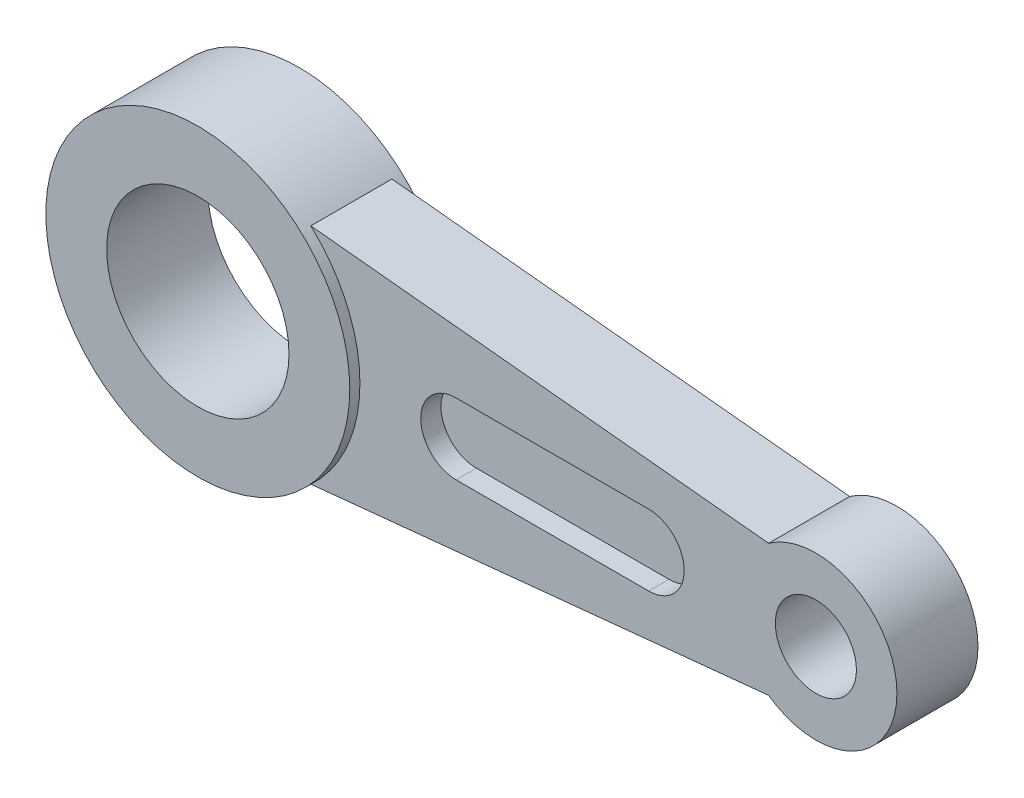
ISO-10303-21;
HEADER;
FILE_DESCRIPTION(('STEP AP214'),'2;1');
FILE_NAME('part.step','',(''),(''),'','','');
FILE_SCHEMA(('AUTOMOTIVE_DESIGN { 1 0 10303 214 1 1 1 1 }'));
ENDSEC;
DATA;
#1=APPLICATION_CONTEXT('core data for automotive mechanical design processes');
#2=APPLICATION_PROTOCOL_DEFINITION('international standard','automotive_design',2000,#1);
#3=PRODUCT_CONTEXT('',#1,'mechanical');
#4=PRODUCT('Part','Part','',(#3));
#5=PRODUCT_RELATED_PRODUCT_CATEGORY('part','',(#4));
#6=PRODUCT_DEFINITION_FORMATION('','',#4);
#7=PRODUCT_DEFINITION_CONTEXT('part definition',#1,'design');
#8=PRODUCT_DEFINITION('design','',#6,#7);
#9=PRODUCT_DEFINITION_SHAPE('','',#8);
#10=(LENGTH_UNIT() NAMED_UNIT(*) SI_UNIT(.MILLI.,.METRE.));
#11=(NAMED_UNIT(*) PLANE_ANGLE_UNIT() SI_UNIT($,.RADIAN.));
#12=(NAMED_UNIT(*) SI_UNIT($,.STERADIAN.) SOLID_ANGLE_UNIT());
#13=UNCERTAINTY_MEASURE_WITH_UNIT(LENGTH_MEASURE(1.E-05),#10,'distance_accuracy_value','');
#14=(GEOMETRIC_REPRESENTATION_CONTEXT(3) GLOBAL_UNCERTAINTY_ASSIGNED_CONTEXT((#13)) GLOBAL_UNIT_ASSIGNED_CONTEXT((#10,
#11,#12)) REPRESENTATION_CONTEXT('',''));
#15=CARTESIAN_POINT('',(0.,0.,0.));
#16=DIRECTION('',(0.,0.,1.));
#17=DIRECTION('',(1.,0.,0.));
#18=AXIS2_PLACEMENT_3D('',#15,#16,#17);
#19=CARTESIAN_POINT('',(0.,0.,-8.));
#20=DIRECTION('',(0.,0.,1.));
#21=DIRECTION('',(1.,0.,0.));
#22=AXIS2_PLACEMENT_3D('',#19,#20,#21);
#23=PLANE('',#22);
#24=DIRECTION('',(-0.99498743710662,0.1,0.));
#25=VECTOR('',#24,1.);
#26=CARTESIAN_POINT('',(121.2,11.9398492452794,-8.));
#27=LINE('',#26,#25);
#28=CARTESIAN_POINT('',(110.670042735129,12.9981497697053,-8.));
#29=VERTEX_POINT('',#28);
#30=CARTESIAN_POINT('',(20.3097738679192,22.0796984905589,-8.));
#31=VERTEX_POINT('',#30);
#32=EDGE_CURVE('E265',#29,#31,#27,.T.);
#33=ORIENTED_EDGE('',*,*,#32,.F.);
#34=CARTESIAN_POINT('',(120.,0.,-8.));
#35=DIRECTION('',(0.,0.,1.));
#36=DIRECTION('',(1.,0.,0.));
#37=AXIS2_PLACEMENT_3D('',#34,#35,#36);
#38=CIRCLE('',#37,16.);
#39=CARTESIAN_POINT('',(110.670042735129,-12.9981497697053,-8.));
#40=VERTEX_POINT('',#39);
#41=EDGE_CURVE('E226',#40,#29,#38,.T.);
#42=ORIENTED_EDGE('',*,*,#41,.F.);
#43=DIRECTION('',(0.99498743710662,0.1,0.));
#44=VECTOR('',#43,1.);
#45=CARTESIAN_POINT('',(2.4,-23.8796984905589,-8.));
#46=LINE('',#45,#44);
#47=CARTESIAN_POINT('',(20.3097738679192,-22.0796984905589,-8.));
#48=VERTEX_POINT('',#47);
#49=EDGE_CURVE('E260',#48,#40,#46,.T.);
#50=ORIENTED_EDGE('',*,*,#49,.F.);
#51=CARTESIAN_POINT('',(0.,0.,-8.));
#52=DIRECTION('',(0.,0.,1.));
#53=DIRECTION('',(1.,0.,0.));
#54=AXIS2_PLACEMENT_3D('',#51,#52,#53);
#55=CIRCLE('',#54,30.);
#56=EDGE_CURVE('E11',#31,#48,#55,.F.);
#57=ORIENTED_EDGE('',*,*,#56,.F.);
#58=EDGE_LOOP('',(#33,#42,#50,#57));
#59=FACE_BOUND('',#58,.T.);
#60=CARTESIAN_POINT('',(120.,0.,-8.00000000000001));
#61=DIRECTION('',(0.,0.,1.));
#62=DIRECTION('',(1.,0.,0.));
#63=AXIS2_PLACEMENT_3D('',#60,#61,#62);
#64=CIRCLE('',#63,8.00000000000001);
#65=CARTESIAN_POINT('',(128.,0.,-8.00000000000001));
#66=VERTEX_POINT('',#65);
#67=EDGE_CURVE('E56',#66,#66,#64,.T.);
#68=ORIENTED_EDGE('',*,*,#67,.T.);
#69=EDGE_LOOP('',(#68));
#70=FACE_BOUND('',#69,.T.);
#71=CARTESIAN_POINT('',(49.,0.,-8.));
#72=DIRECTION('',(0.,0.,1.));
#73=DIRECTION('',(1.,0.,0.));
#74=AXIS2_PLACEMENT_3D('',#71,#72,#73);
#75=CIRCLE('',#74,7.);
#76=CARTESIAN_POINT('',(49.,7.,-8.));
#77=VERTEX_POINT('',#76);
#78=CARTESIAN_POINT('',(49.,-7.,-8.));
#79=VERTEX_POINT('',#78);
#80=EDGE_CURVE('E70',#77,#79,#75,.T.);
#81=ORIENTED_EDGE('',*,*,#80,.T.);
#82=DIRECTION('',(1.,0.,0.));
#83=VECTOR('',#82,1.);
#84=CARTESIAN_POINT('',(49.,-7.,-8.));
#85=LINE('',#84,#83);
#86=CARTESIAN_POINT('',(87.,-7.,-8.));
#87=VERTEX_POINT('',#86);
#88=EDGE_CURVE('E165',#79,#87,#85,.T.);
#89=ORIENTED_EDGE('',*,*,#88,.T.);
#90=CARTESIAN_POINT('',(87.,0.,-8.));
#91=DIRECTION('',(0.,0.,1.));
#92=DIRECTION('',(1.,0.,0.));
#93=AXIS2_PLACEMENT_3D('',#90,#91,#92);
#94=CIRCLE('',#93,7.);
#95=CARTESIAN_POINT('',(87.,7.,-8.));
#96=VERTEX_POINT('',#95);
#97=EDGE_CURVE('E380',#87,#96,#94,.T.);
#98=ORIENTED_EDGE('',*,*,#97,.T.);
#99=DIRECTION('',(-1.,0.,0.));
#100=VECTOR('',#99,1.);
#101=CARTESIAN_POINT('',(87.,7.,-8.));
#102=LINE('',#101,#100);
#103=EDGE_CURVE('E161',#96,#77,#102,.T.);
#104=ORIENTED_EDGE('',*,*,#103,.T.);
#105=EDGE_LOOP('',(#81,#89,#98,#104));
#106=FACE_BOUND('',#105,.T.);
#107=ADVANCED_FACE('F51',(#59,#70,#106),#23,.F.);
#108=CARTESIAN_POINT('',(2.4,-23.8796984905589,8.));
#109=DIRECTION('',(-0.1,0.99498743710662,0.));
#110=DIRECTION('',(-0.99498743710662,-0.1,0.));
#111=AXIS2_PLACEMENT_3D('',#108,#109,#110);
#112=PLANE('',#111);
#113=DIRECTION('',(0.,0.,-1.));
#114=VECTOR('',#113,1.);
#115=CARTESIAN_POINT('',(110.670042735129,-12.9981497697053,8.));
#116=LINE('',#115,#114);
#117=CARTESIAN_POINT('',(110.670042735129,-12.9981497697053,8.));
#118=VERTEX_POINT('',#117);
#119=EDGE_CURVE('E238',#118,#40,#116,.T.);
#120=ORIENTED_EDGE('',*,*,#119,.F.);
#121=DIRECTION('',(0.99498743710662,0.1,0.));
#122=VECTOR('',#121,1.);
#123=CARTESIAN_POINT('',(2.4,-23.8796984905589,8.));
#124=LINE('',#123,#122);
#125=CARTESIAN_POINT('',(20.3097738679192,-22.0796984905589,8.));
#126=VERTEX_POINT('',#125);
#127=EDGE_CURVE('E261',#126,#118,#124,.T.);
#128=ORIENTED_EDGE('',*,*,#127,.F.);
#129=DIRECTION('',(0.,0.,-1.));
#130=VECTOR('',#129,1.);
#131=CARTESIAN_POINT('',(20.3097738679191,-22.0796984905589,10.));
#132=LINE('',#131,#130);
#133=EDGE_CURVE('E253',#48,#126,#132,.F.);
#134=ORIENTED_EDGE('',*,*,#133,.F.);
#135=ORIENTED_EDGE('',*,*,#49,.T.);
#136=EDGE_LOOP('',(#120,#128,#134,#135));
#137=FACE_BOUND('',#136,.T.);
#138=ADVANCED_FACE('F54',(#137),#112,.F.);
#139=CARTESIAN_POINT('',(121.2,11.9398492452794,8.));
#140=DIRECTION('',(-0.1,-0.99498743710662,0.));
#141=DIRECTION('',(0.99498743710662,-0.1,0.));
#142=AXIS2_PLACEMENT_3D('',#139,#140,#141);
#143=PLANE('',#142);
#144=DIRECTION('',(0.,0.,-1.));
#145=VECTOR('',#144,1.);
#146=CARTESIAN_POINT('',(110.670042735129,12.9981497697053,8.));
#147=LINE('',#146,#145);
#148=CARTESIAN_POINT('',(110.670042735129,12.9981497697053,8.));
#149=VERTEX_POINT('',#148);
#150=EDGE_CURVE('E231',#29,#149,#147,.F.);
#151=ORIENTED_EDGE('',*,*,#150,.F.);
#152=ORIENTED_EDGE('',*,*,#32,.T.);
#153=DIRECTION('',(0.,0.,-1.));
#154=VECTOR('',#153,1.);
#155=CARTESIAN_POINT('',(20.3097738679191,22.0796984905589,10.));
#156=LINE('',#155,#154);
#157=CARTESIAN_POINT('',(20.3097738679192,22.0796984905589,8.));
#158=VERTEX_POINT('',#157);
#159=EDGE_CURVE('E246',#158,#31,#156,.T.);
#160=ORIENTED_EDGE('',*,*,#159,.F.);
#161=DIRECTION('',(-0.99498743710662,0.1,0.));
#162=VECTOR('',#161,1.);
#163=CARTESIAN_POINT('',(121.2,11.9398492452794,8.));
#164=LINE('',#163,#162);
#165=EDGE_CURVE('E62',#149,#158,#164,.T.);
#166=ORIENTED_EDGE('',*,*,#165,.F.);
#167=EDGE_LOOP('',(#151,#152,#160,#166));
#168=FACE_BOUND('',#167,.T.);
#169=ADVANCED_FACE('F299',(#168),#143,.F.);
#170=CARTESIAN_POINT('',(0.,0.,8.));
#171=DIRECTION('',(0.,0.,1.));
#172=DIRECTION('',(1.,0.,0.));
#173=AXIS2_PLACEMENT_3D('',#170,#171,#172);
#174=PLANE('',#173);
#175=CARTESIAN_POINT('',(49.,0.,8.));
#176=DIRECTION('',(0.,0.,1.));
#177=DIRECTION('',(1.,0.,0.));
#178=AXIS2_PLACEMENT_3D('',#175,#176,#177);
#179=CIRCLE('',#178,7.);
#180=CARTESIAN_POINT('',(49.,7.,8.));
#181=VERTEX_POINT('',#180);
#182=CARTESIAN_POINT('',(49.,-7.,8.));
#183=VERTEX_POINT('',#182);
#184=EDGE_CURVE('E78',#181,#183,#179,.T.);
#185=ORIENTED_EDGE('',*,*,#184,.F.);
#186=DIRECTION('',(-1.,0.,0.));
#187=VECTOR('',#186,1.);
#188=CARTESIAN_POINT('',(87.,7.,8.));
#189=LINE('',#188,#187);
#190=CARTESIAN_POINT('',(87.,7.,8.));
#191=VERTEX_POINT('',#190);
#192=EDGE_CURVE('E184',#191,#181,#189,.T.);
#193=ORIENTED_EDGE('',*,*,#192,.F.);
#194=CARTESIAN_POINT('',(87.,0.,8.));
#195=DIRECTION('',(0.,0.,1.));
#196=DIRECTION('',(1.,0.,0.));
#197=AXIS2_PLACEMENT_3D('',#194,#195,#196);
#198=CIRCLE('',#197,7.);
#199=CARTESIAN_POINT('',(87.,-7.,8.));
#200=VERTEX_POINT('',#199);
#201=EDGE_CURVE('E200',#200,#191,#198,.T.);
#202=ORIENTED_EDGE('',*,*,#201,.F.);
#203=DIRECTION('',(1.,0.,0.));
#204=VECTOR('',#203,1.);
#205=CARTESIAN_POINT('',(49.,-7.,8.));
#206=LINE('',#205,#204);
#207=EDGE_CURVE('E172',#183,#200,#206,.T.);
#208=ORIENTED_EDGE('',*,*,#207,.F.);
#209=EDGE_LOOP('',(#185,#193,#202,#208));
#210=FACE_BOUND('',#209,.T.);
#211=CARTESIAN_POINT('',(120.,0.,8.00000000000001));
#212=DIRECTION('',(0.,0.,1.));
#213=DIRECTION('',(1.,0.,0.));
#214=AXIS2_PLACEMENT_3D('',#211,#212,#213);
#215=CIRCLE('',#214,8.00000000000001);
#216=CARTESIAN_POINT('',(128.,0.,8.00000000000001));
#217=VERTEX_POINT('',#216);
#218=EDGE_CURVE('E217',#217,#217,#215,.T.);
#219=ORIENTED_EDGE('',*,*,#218,.F.);
#220=EDGE_LOOP('',(#219));
#221=FACE_BOUND('',#220,.T.);
#222=CARTESIAN_POINT('',(120.,0.,8.));
#223=DIRECTION('',(0.,0.,1.));
#224=DIRECTION('',(1.,0.,0.));
#225=AXIS2_PLACEMENT_3D('',#222,#223,#224);
#226=CIRCLE('',#225,16.);
#227=EDGE_CURVE('E227',#118,#149,#226,.T.);
#228=ORIENTED_EDGE('',*,*,#227,.T.);
#229=ORIENTED_EDGE('',*,*,#165,.T.);
#230=CARTESIAN_POINT('',(0.,0.,8.));
#231=DIRECTION('',(0.,0.,1.));
#232=DIRECTION('',(1.,0.,0.));
#233=AXIS2_PLACEMENT_3D('',#230,#231,#232);
#234=CIRCLE('',#233,30.);
#235=EDGE_CURVE('E257',#158,#126,#234,.F.);
#236=ORIENTED_EDGE('',*,*,#235,.T.);
#237=ORIENTED_EDGE('',*,*,#127,.T.);
#238=EDGE_LOOP('',(#228,#229,#236,#237));
#239=FACE_BOUND('',#238,.T.);
#240=ADVANCED_FACE('F306',(#210,#221,#239),#174,.T.);
#241=CARTESIAN_POINT('',(0.,0.,10.));
#242=DIRECTION('',(0.,0.,-1.));
#243=DIRECTION('',(-1.,0.,0.));
#244=AXIS2_PLACEMENT_3D('',#241,#242,#243);
#245=CYLINDRICAL_SURFACE('',#244,30.);
#246=ORIENTED_EDGE('',*,*,#235,.F.);
#247=ORIENTED_EDGE('',*,*,#159,.T.);
#248=ORIENTED_EDGE('',*,*,#56,.T.);
#249=ORIENTED_EDGE('',*,*,#133,.T.);
#250=EDGE_LOOP('',(#246,#247,#248,#249));
#251=FACE_BOUND('',#250,.T.);
#252=CARTESIAN_POINT('',(0.,0.,10.));
#253=DIRECTION('',(0.,0.,1.));
#254=DIRECTION('',(1.,0.,0.));
#255=AXIS2_PLACEMENT_3D('',#252,#253,#254);
#256=CIRCLE('',#255,30.);
#257=CARTESIAN_POINT('',(30.,0.,10.));
#258=VERTEX_POINT('',#257);
#259=EDGE_CURVE('E243',#258,#258,#256,.T.);
#260=ORIENTED_EDGE('',*,*,#259,.F.);
#261=EDGE_LOOP('',(#260));
#262=FACE_BOUND('',#261,.T.);
#263=CARTESIAN_POINT('',(0.,0.,-10.));
#264=DIRECTION('',(0.,0.,1.));
#265=DIRECTION('',(1.,0.,0.));
#266=AXIS2_PLACEMENT_3D('',#263,#264,#265);
#267=CIRCLE('',#266,30.);
#268=CARTESIAN_POINT('',(30.,0.,-10.));
#269=VERTEX_POINT('',#268);
#270=EDGE_CURVE('E242',#269,#269,#267,.T.);
#271=ORIENTED_EDGE('',*,*,#270,.T.);
#272=EDGE_LOOP('',(#271));
#273=FACE_BOUND('',#272,.T.);
#274=ADVANCED_FACE('F313',(#251,#262,#273),#245,.T.);
#275=CARTESIAN_POINT('',(0.,0.,10.));
#276=DIRECTION('',(0.,0.,1.));
#277=DIRECTION('',(1.,0.,0.));
#278=AXIS2_PLACEMENT_3D('',#275,#276,#277);
#279=PLANE('',#278);
#280=CARTESIAN_POINT('',(0.,0.,10.));
#281=DIRECTION('',(0.,0.,1.));
#282=DIRECTION('',(1.,0.,0.));
#283=AXIS2_PLACEMENT_3D('',#280,#281,#282);
#284=CIRCLE('',#283,18.);
#285=CARTESIAN_POINT('',(18.,0.,10.));
#286=VERTEX_POINT('',#285);
#287=EDGE_CURVE('E222',#286,#286,#284,.T.);
#288=ORIENTED_EDGE('',*,*,#287,.F.);
#289=EDGE_LOOP('',(#288));
#290=FACE_BOUND('',#289,.T.);
#291=ORIENTED_EDGE('',*,*,#259,.T.);
#292=EDGE_LOOP('',(#291));
#293=FACE_BOUND('',#292,.T.);
#294=ADVANCED_FACE('F326',(#290,#293),#279,.T.);
#295=CARTESIAN_POINT('',(0.,0.,-10.));
#296=DIRECTION('',(0.,0.,1.));
#297=DIRECTION('',(1.,0.,0.));
#298=AXIS2_PLACEMENT_3D('',#295,#296,#297);
#299=PLANE('',#298);
#300=CARTESIAN_POINT('',(0.,0.,-10.));
#301=DIRECTION('',(0.,0.,1.));
#302=DIRECTION('',(1.,0.,0.));
#303=AXIS2_PLACEMENT_3D('',#300,#301,#302);
#304=CIRCLE('',#303,18.);
#305=CARTESIAN_POINT('',(18.,0.,-10.));
#306=VERTEX_POINT('',#305);
#307=EDGE_CURVE('E221',#306,#306,#304,.T.);
#308=ORIENTED_EDGE('',*,*,#307,.T.);
#309=EDGE_LOOP('',(#308));
#310=FACE_BOUND('',#309,.T.);
#311=ORIENTED_EDGE('',*,*,#270,.F.);
#312=EDGE_LOOP('',(#311));
#313=FACE_BOUND('',#312,.T.);
#314=ADVANCED_FACE('F276',(#310,#313),#299,.F.);
#315=CARTESIAN_POINT('',(120.,0.,8.));
#316=DIRECTION('',(0.,0.,-1.));
#317=DIRECTION('',(-1.,0.,0.));
#318=AXIS2_PLACEMENT_3D('',#315,#316,#317);
#319=CYLINDRICAL_SURFACE('',#318,16.);
#320=ORIENTED_EDGE('',*,*,#227,.F.);
#321=ORIENTED_EDGE('',*,*,#119,.T.);
#322=ORIENTED_EDGE('',*,*,#41,.T.);
#323=ORIENTED_EDGE('',*,*,#150,.T.);
#324=EDGE_LOOP('',(#320,#321,#322,#323));
#325=FACE_BOUND('',#324,.T.);
#326=ADVANCED_FACE('F282',(#325),#319,.T.);
#327=CARTESIAN_POINT('',(0.,0.,-167.));
#328=DIRECTION('',(0.,0.,1.));
#329=DIRECTION('',(1.,0.,0.));
#330=AXIS2_PLACEMENT_3D('',#327,#328,#329);
#331=CYLINDRICAL_SURFACE('',#330,18.);
#332=CARTESIAN_POINT('',(18.,0.,10.));
#333=CARTESIAN_POINT('',(18.,0.,9.79166666666668));
#334=CARTESIAN_POINT('',(18.,0.,9.58333333333335));
#335=CARTESIAN_POINT('',(18.,0.,9.16666666666668));
#336=CARTESIAN_POINT('',(18.,0.,8.95833333333335));
#337=CARTESIAN_POINT('',(18.,0.,8.54166666666667));
#338=CARTESIAN_POINT('',(18.,0.,8.33333333333333));
#339=CARTESIAN_POINT('',(18.,0.,7.91666666666666));
#340=CARTESIAN_POINT('',(18.,0.,7.70833333333334));
#341=CARTESIAN_POINT('',(18.,0.,7.29166666666668));
#342=CARTESIAN_POINT('',(18.,0.,7.08333333333335));
#343=CARTESIAN_POINT('',(18.,0.,6.66666666666668));
#344=CARTESIAN_POINT('',(18.,0.,6.45833333333334));
#345=CARTESIAN_POINT('',(18.,0.,6.04166666666667));
#346=CARTESIAN_POINT('',(18.,0.,5.83333333333333));
#347=CARTESIAN_POINT('',(18.,0.,5.41666666666666));
#348=CARTESIAN_POINT('',(18.,0.,5.20833333333333));
#349=CARTESIAN_POINT('',(18.,0.,4.79166666666668));
#350=CARTESIAN_POINT('',(18.,0.,4.58333333333335));
#351=CARTESIAN_POINT('',(18.,0.,4.16666666666668));
#352=CARTESIAN_POINT('',(18.,0.,3.95833333333334));
#353=CARTESIAN_POINT('',(18.,0.,3.54166666666667));
#354=CARTESIAN_POINT('',(18.,0.,3.33333333333333));
#355=CARTESIAN_POINT('',(18.,0.,2.91666666666666));
#356=CARTESIAN_POINT('',(18.,0.,2.70833333333333));
#357=CARTESIAN_POINT('',(18.,0.,2.29166666666667));
#358=CARTESIAN_POINT('',(18.,0.,2.08333333333334));
#359=CARTESIAN_POINT('',(18.,0.,1.66666666666668));
#360=CARTESIAN_POINT('',(18.,0.,1.45833333333334));
#361=CARTESIAN_POINT('',(18.,0.,1.04166666666666));
#362=CARTESIAN_POINT('',(18.,0.,0.833333333333325));
#363=CARTESIAN_POINT('',(18.,0.,0.416666666666658));
#364=CARTESIAN_POINT('',(18.,0.,0.208333333333329));
#365=CARTESIAN_POINT('',(18.,0.,-0.208333333333329));
#366=CARTESIAN_POINT('',(18.,0.,-0.416666666666658));
#367=CARTESIAN_POINT('',(18.,0.,-0.833333333333325));
#368=CARTESIAN_POINT('',(18.,0.,-1.04166666666666));
#369=CARTESIAN_POINT('',(18.,0.,-1.45833333333334));
#370=CARTESIAN_POINT('',(18.,0.,-1.66666666666668));
#371=CARTESIAN_POINT('',(18.,0.,-2.08333333333334));
#372=CARTESIAN_POINT('',(18.,0.,-2.29166666666667));
#373=CARTESIAN_POINT('',(18.,0.,-2.70833333333333));
#374=CARTESIAN_POINT('',(18.,0.,-2.91666666666666));
#375=CARTESIAN_POINT('',(18.,0.,-3.33333333333333));
#376=CARTESIAN_POINT('',(18.,0.,-3.54166666666667));
#377=CARTESIAN_POINT('',(18.,0.,-3.95833333333334));
#378=CARTESIAN_POINT('',(18.,0.,-4.16666666666668));
#379=CARTESIAN_POINT('',(18.,0.,-4.58333333333335));
#380=CARTESIAN_POINT('',(18.,0.,-4.79166666666668));
#381=CARTESIAN_POINT('',(18.,0.,-5.20833333333333));
#382=CARTESIAN_POINT('',(18.,0.,-5.41666666666666));
#383=CARTESIAN_POINT('',(18.,0.,-5.83333333333333));
#384=CARTESIAN_POINT('',(18.,0.,-6.04166666666667));
#385=CARTESIAN_POINT('',(18.,0.,-6.45833333333334));
#386=CARTESIAN_POINT('',(18.,0.,-6.66666666666668));
#387=CARTESIAN_POINT('',(18.,0.,-7.08333333333335));
#388=CARTESIAN_POINT('',(18.,0.,-7.29166666666668));
#389=CARTESIAN_POINT('',(18.,0.,-7.70833333333334));
#390=CARTESIAN_POINT('',(18.,0.,-7.91666666666666));
#391=CARTESIAN_POINT('',(18.,0.,-8.33333333333333));
#392=CARTESIAN_POINT('',(18.,0.,-8.54166666666667));
#393=CARTESIAN_POINT('',(18.,0.,-8.95833333333335));
#394=CARTESIAN_POINT('',(18.,0.,-9.16666666666668));
#395=CARTESIAN_POINT('',(18.,0.,-9.58333333333335));
#396=CARTESIAN_POINT('',(18.,0.,-9.79166666666668));
#397=CARTESIAN_POINT('',(18.,0.,-10.));
#398=B_SPLINE_CURVE_WITH_KNOTS('',3,(#332,#333,#334,#335,#336,#337,#338,#339,#340,#341,#342,
#343,#344,#345,#346,#347,#348,#349,#350,#351,#352,#353,#354,#355,#356,#357,#358,#359,#360,#361,
#362,#363,#364,#365,#366,#367,#368,#369,#370,#371,#372,#373,#374,#375,#376,#377,#378,#379,#380,
#381,#382,#383,#384,#385,#386,#387,#388,#389,#390,#391,#392,#393,#394,#395,#396,#397),
.UNSPECIFIED.,.F.,.F.,(4,2,2,2,2,2,2,2,2,2,2,2,2,2,2,2,2,2,2,2,2,2,2,2,2,2,2,2,2,2,2,2,4),(0.,
0.624999999999987,1.25,1.87500000000002,2.5,3.12499999999999,3.75,4.37500000000002,5.,
5.62499999999999,6.25000000000001,6.87500000000002,7.50000000000001,8.12499999999999,
8.75000000000001,9.37500000000002,10.,10.625,11.25,11.875,12.5,13.125,13.75,14.375,15.,15.625,
16.25,16.875,17.5,18.125,18.75,19.375,20.),.UNSPECIFIED.);
#399=EDGE_CURVE('BSEAM279',#286,#306,#398,.T.);
#400=ORIENTED_EDGE('',*,*,#287,.T.);
#401=ORIENTED_EDGE('',*,*,#307,.F.);
#402=ORIENTED_EDGE('',*,*,#399,.T.);
#403=ORIENTED_EDGE('',*,*,#399,.F.);
#404=EDGE_LOOP('',(#400,#402,#401,#403));
#405=FACE_BOUND('',#404,.T.);
#406=ADVANCED_FACE('F279',(#405),#331,.F.);
#407=CARTESIAN_POINT('',(120.,0.,-167.));
#408=DIRECTION('',(0.,0.,1.));
#409=DIRECTION('',(1.,0.,0.));
#410=AXIS2_PLACEMENT_3D('',#407,#408,#409);
#411=CYLINDRICAL_SURFACE('',#410,8.00000000000001);
#412=CARTESIAN_POINT('',(128.,0.,8.00000000000001));
#413=CARTESIAN_POINT('',(128.,0.,7.83333333333334));
#414=CARTESIAN_POINT('',(128.,0.,7.66666666666667));
#415=CARTESIAN_POINT('',(128.,0.,7.33333333333334));
#416=CARTESIAN_POINT('',(128.,0.,7.16666666666667));
#417=CARTESIAN_POINT('',(128.,0.,6.83333333333334));
#418=CARTESIAN_POINT('',(128.,0.,6.66666666666667));
#419=CARTESIAN_POINT('',(128.,0.,6.33333333333334));
#420=CARTESIAN_POINT('',(128.,0.,6.16666666666667));
#421=CARTESIAN_POINT('',(128.,0.,5.83333333333334));
#422=CARTESIAN_POINT('',(128.,0.,5.66666666666667));
#423=CARTESIAN_POINT('',(128.,0.,5.33333333333334));
#424=CARTESIAN_POINT('',(128.,0.,5.16666666666667));
#425=CARTESIAN_POINT('',(128.,0.,4.83333333333334));
#426=CARTESIAN_POINT('',(128.,0.,4.66666666666667));
#427=CARTESIAN_POINT('',(128.,0.,4.33333333333334));
#428=CARTESIAN_POINT('',(128.,0.,4.16666666666667));
#429=CARTESIAN_POINT('',(128.,0.,3.83333333333334));
#430=CARTESIAN_POINT('',(128.,0.,3.66666666666667));
#431=CARTESIAN_POINT('',(128.,0.,3.33333333333334));
#432=CARTESIAN_POINT('',(128.,0.,3.16666666666667));
#433=CARTESIAN_POINT('',(128.,0.,2.83333333333334));
#434=CARTESIAN_POINT('',(128.,0.,2.66666666666667));
#435=CARTESIAN_POINT('',(128.,0.,2.33333333333334));
#436=CARTESIAN_POINT('',(128.,0.,2.16666666666667));
#437=CARTESIAN_POINT('',(128.,0.,1.83333333333334));
#438=CARTESIAN_POINT('',(128.,0.,1.66666666666667));
#439=CARTESIAN_POINT('',(128.,0.,1.33333333333333));
#440=CARTESIAN_POINT('',(128.,0.,1.16666666666667));
#441=CARTESIAN_POINT('',(128.,0.,0.833333333333334));
#442=CARTESIAN_POINT('',(128.,0.,0.666666666666667));
#443=CARTESIAN_POINT('',(128.,0.,0.333333333333334));
#444=CARTESIAN_POINT('',(128.,0.,0.166666666666667));
#445=CARTESIAN_POINT('',(128.,0.,-0.166666666666667));
#446=CARTESIAN_POINT('',(128.,0.,-0.333333333333334));
#447=CARTESIAN_POINT('',(128.,0.,-0.666666666666667));
#448=CARTESIAN_POINT('',(128.,0.,-0.833333333333334));
#449=CARTESIAN_POINT('',(128.,0.,-1.16666666666667));
#450=CARTESIAN_POINT('',(128.,0.,-1.33333333333333));
#451=CARTESIAN_POINT('',(128.,0.,-1.66666666666667));
#452=CARTESIAN_POINT('',(128.,0.,-1.83333333333334));
#453=CARTESIAN_POINT('',(128.,0.,-2.16666666666667));
#454=CARTESIAN_POINT('',(128.,0.,-2.33333333333334));
#455=CARTESIAN_POINT('',(128.,0.,-2.66666666666667));
#456=CARTESIAN_POINT('',(128.,0.,-2.83333333333334));
#457=CARTESIAN_POINT('',(128.,0.,-3.16666666666667));
#458=CARTESIAN_POINT('',(128.,0.,-3.33333333333334));
#459=CARTESIAN_POINT('',(128.,0.,-3.66666666666667));
#460=CARTESIAN_POINT('',(128.,0.,-3.83333333333334));
#461=CARTESIAN_POINT('',(128.,0.,-4.16666666666667));
#462=CARTESIAN_POINT('',(128.,0.,-4.33333333333334));
#463=CARTESIAN_POINT('',(128.,0.,-4.66666666666667));
#464=CARTESIAN_POINT('',(128.,0.,-4.83333333333334));
#465=CARTESIAN_POINT('',(128.,0.,-5.16666666666667));
#466=CARTESIAN_POINT('',(128.,0.,-5.33333333333334));
#467=CARTESIAN_POINT('',(128.,0.,-5.66666666666667));
#468=CARTESIAN_POINT('',(128.,0.,-5.83333333333334));
#469=CARTESIAN_POINT('',(128.,0.,-6.16666666666667));
#470=CARTESIAN_POINT('',(128.,0.,-6.33333333333334));
#471=CARTESIAN_POINT('',(128.,0.,-6.66666666666667));
#472=CARTESIAN_POINT('',(128.,0.,-6.83333333333334));
#473=CARTESIAN_POINT('',(128.,0.,-7.16666666666667));
#474=CARTESIAN_POINT('',(128.,0.,-7.33333333333334));
#475=CARTESIAN_POINT('',(128.,0.,-7.66666666666667));
#476=CARTESIAN_POINT('',(128.,0.,-7.83333333333334));
#477=CARTESIAN_POINT('',(128.,0.,-8.00000000000001));
#478=B_SPLINE_CURVE_WITH_KNOTS('',3,(#412,#413,#414,#415,#416,#417,#418,#419,#420,#421,#422,
#423,#424,#425,#426,#427,#428,#429,#430,#431,#432,#433,#434,#435,#436,#437,#438,#439,#440,#441,
#442,#443,#444,#445,#446,#447,#448,#449,#450,#451,#452,#453,#454,#455,#456,#457,#458,#459,#460,
#461,#462,#463,#464,#465,#466,#467,#468,#469,#470,#471,#472,#473,#474,#475,#476,#477),
.UNSPECIFIED.,.F.,.F.,(4,2,2,2,2,2,2,2,2,2,2,2,2,2,2,2,2,2,2,2,2,2,2,2,2,2,2,2,2,2,2,2,4),(0.,
0.5,1.,1.5,2.,2.5,3.,3.5,4.,4.5,5.,5.50000000000001,6.00000000000001,6.50000000000001,
7.00000000000001,7.50000000000001,8.00000000000001,8.50000000000001,9.00000000000001,
9.50000000000001,10.,10.5,11.,11.5,12.,12.5,13.,13.5,14.,14.5,15.,15.5,16.),.UNSPECIFIED.);
#479=EDGE_CURVE('BSEAM281',#217,#66,#478,.T.);
#480=ORIENTED_EDGE('',*,*,#218,.T.);
#481=ORIENTED_EDGE('',*,*,#67,.F.);
#482=ORIENTED_EDGE('',*,*,#479,.T.);
#483=ORIENTED_EDGE('',*,*,#479,.F.);
#484=EDGE_LOOP('',(#480,#482,#481,#483));
#485=FACE_BOUND('',#484,.T.);
#486=ADVANCED_FACE('F281',(#485),#411,.F.);
#487=CARTESIAN_POINT('',(49.,0.,4.));
#488=DIRECTION('',(0.,0.,1.));
#489=DIRECTION('',(1.,0.,0.));
#490=AXIS2_PLACEMENT_3D('',#487,#488,#489);
#491=CYLINDRICAL_SURFACE('',#490,7.);
#492=ORIENTED_EDGE('',*,*,#184,.T.);
#493=DIRECTION('',(0.,0.,1.));
#494=VECTOR('',#493,1.);
#495=CARTESIAN_POINT('',(49.,-7.,4.));
#496=LINE('',#495,#494);
#497=CARTESIAN_POINT('',(49.,-7.,4.));
#498=VERTEX_POINT('',#497);
#499=EDGE_CURVE('E195',#498,#183,#496,.T.);
#500=ORIENTED_EDGE('',*,*,#499,.F.);
#501=CARTESIAN_POINT('',(49.,0.,4.));
#502=DIRECTION('',(0.,0.,1.));
#503=DIRECTION('',(1.,0.,0.));
#504=AXIS2_PLACEMENT_3D('',#501,#502,#503);
#505=CIRCLE('',#504,7.);
#506=CARTESIAN_POINT('',(49.,7.,4.));
#507=VERTEX_POINT('',#506);
#508=EDGE_CURVE('E179',#507,#498,#505,.T.);
#509=ORIENTED_EDGE('',*,*,#508,.F.);
#510=DIRECTION('',(0.,0.,1.));
#511=VECTOR('',#510,1.);
#512=CARTESIAN_POINT('',(49.,7.,4.));
#513=LINE('',#512,#511);
#514=EDGE_CURVE('E207',#507,#181,#513,.T.);
#515=ORIENTED_EDGE('',*,*,#514,.T.);
#516=EDGE_LOOP('',(#492,#500,#509,#515));
#517=FACE_BOUND('',#516,.T.);
#518=ADVANCED_FACE('F288',(#517),#491,.F.);
#519=CARTESIAN_POINT('',(87.,7.,4.));
#520=DIRECTION('',(0.,1.,0.));
#521=DIRECTION('',(0.,0.,1.));
#522=AXIS2_PLACEMENT_3D('',#519,#520,#521);
#523=PLANE('',#522);
#524=ORIENTED_EDGE('',*,*,#192,.T.);
#525=ORIENTED_EDGE('',*,*,#514,.F.);
#526=DIRECTION('',(-1.,0.,0.));
#527=VECTOR('',#526,1.);
#528=CARTESIAN_POINT('',(87.,7.,4.));
#529=LINE('',#528,#527);
#530=CARTESIAN_POINT('',(87.,7.,4.));
#531=VERTEX_POINT('',#530);
#532=EDGE_CURVE('E192',#531,#507,#529,.T.);
#533=ORIENTED_EDGE('',*,*,#532,.F.);
#534=DIRECTION('',(0.,0.,1.));
#535=VECTOR('',#534,1.);
#536=CARTESIAN_POINT('',(87.,7.,4.));
#537=LINE('',#536,#535);
#538=EDGE_CURVE('E210',#531,#191,#537,.T.);
#539=ORIENTED_EDGE('',*,*,#538,.T.);
#540=EDGE_LOOP('',(#524,#525,#533,#539));
#541=FACE_BOUND('',#540,.T.);
#542=ADVANCED_FACE('F347',(#541),#523,.F.);
#543=CARTESIAN_POINT('',(87.,0.,4.));
#544=DIRECTION('',(0.,0.,1.));
#545=DIRECTION('',(1.,0.,0.));
#546=AXIS2_PLACEMENT_3D('',#543,#544,#545);
#547=CYLINDRICAL_SURFACE('',#546,7.);
#548=ORIENTED_EDGE('',*,*,#201,.T.);
#549=ORIENTED_EDGE('',*,*,#538,.F.);
#550=CARTESIAN_POINT('',(87.,0.,4.));
#551=DIRECTION('',(0.,0.,1.));
#552=DIRECTION('',(1.,0.,0.));
#553=AXIS2_PLACEMENT_3D('',#550,#551,#552);
#554=CIRCLE('',#553,7.);
#555=CARTESIAN_POINT('',(87.,-7.,4.));
#556=VERTEX_POINT('',#555);
#557=EDGE_CURVE('E188',#556,#531,#554,.T.);
#558=ORIENTED_EDGE('',*,*,#557,.F.);
#559=DIRECTION('',(0.,0.,1.));
#560=VECTOR('',#559,1.);
#561=CARTESIAN_POINT('',(87.,-7.,4.));
#562=LINE('',#561,#560);
#563=EDGE_CURVE('E213',#556,#200,#562,.T.);
#564=ORIENTED_EDGE('',*,*,#563,.T.);
#565=EDGE_LOOP('',(#548,#549,#558,#564));
#566=FACE_BOUND('',#565,.T.);
#567=ADVANCED_FACE('F351',(#566),#547,.F.);
#568=CARTESIAN_POINT('',(49.,-7.,4.));
#569=DIRECTION('',(0.,-1.,0.));
#570=DIRECTION('',(0.,0.,-1.));
#571=AXIS2_PLACEMENT_3D('',#568,#569,#570);
#572=PLANE('',#571);
#573=ORIENTED_EDGE('',*,*,#207,.T.);
#574=ORIENTED_EDGE('',*,*,#563,.F.);
#575=DIRECTION('',(1.,0.,0.));
#576=VECTOR('',#575,1.);
#577=CARTESIAN_POINT('',(49.,-7.,4.));
#578=LINE('',#577,#576);
#579=EDGE_CURVE('E183',#498,#556,#578,.T.);
#580=ORIENTED_EDGE('',*,*,#579,.F.);
#581=ORIENTED_EDGE('',*,*,#499,.T.);
#582=EDGE_LOOP('',(#573,#574,#580,#581));
#583=FACE_BOUND('',#582,.T.);
#584=ADVANCED_FACE('F353',(#583),#572,.F.);
#585=CARTESIAN_POINT('',(49.,0.,4.));
#586=DIRECTION('',(0.,0.,1.));
#587=DIRECTION('',(1.,0.,0.));
#588=AXIS2_PLACEMENT_3D('',#585,#586,#587);
#589=PLANE('',#588);
#590=ORIENTED_EDGE('',*,*,#508,.T.);
#591=ORIENTED_EDGE('',*,*,#579,.T.);
#592=ORIENTED_EDGE('',*,*,#557,.T.);
#593=ORIENTED_EDGE('',*,*,#532,.T.);
#594=EDGE_LOOP('',(#590,#591,#592,#593));
#595=FACE_BOUND('',#594,.T.);
#596=ADVANCED_FACE('F355',(#595),#589,.T.);
#597=CARTESIAN_POINT('',(49.,0.,-4.));
#598=DIRECTION('',(0.,0.,-1.));
#599=DIRECTION('',(-1.,0.,0.));
#600=AXIS2_PLACEMENT_3D('',#597,#598,#599);
#601=CYLINDRICAL_SURFACE('',#600,7.);
#602=ORIENTED_EDGE('',*,*,#80,.F.);
#603=DIRECTION('',(0.,0.,-1.));
#604=VECTOR('',#603,1.);
#605=CARTESIAN_POINT('',(49.,7.,-4.));
#606=LINE('',#605,#604);
#607=CARTESIAN_POINT('',(49.,7.,-4.));
#608=VERTEX_POINT('',#607);
#609=EDGE_CURVE('E159',#608,#77,#606,.T.);
#610=ORIENTED_EDGE('',*,*,#609,.F.);
#611=CARTESIAN_POINT('',(49.,0.,-4.));
#612=DIRECTION('',(0.,0.,1.));
#613=DIRECTION('',(1.,0.,0.));
#614=AXIS2_PLACEMENT_3D('',#611,#612,#613);
#615=CIRCLE('',#614,7.);
#616=CARTESIAN_POINT('',(49.,-7.,-4.));
#617=VERTEX_POINT('',#616);
#618=EDGE_CURVE('E150',#608,#617,#615,.T.);
#619=ORIENTED_EDGE('',*,*,#618,.T.);
#620=DIRECTION('',(0.,0.,-1.));
#621=VECTOR('',#620,1.);
#622=CARTESIAN_POINT('',(49.,-7.,-4.));
#623=LINE('',#622,#621);
#624=EDGE_CURVE('E158',#617,#79,#623,.T.);
#625=ORIENTED_EDGE('',*,*,#624,.T.);
#626=EDGE_LOOP('',(#602,#610,#619,#625));
#627=FACE_BOUND('',#626,.T.);
#628=ADVANCED_FACE('F157',(#627),#601,.F.);
#629=CARTESIAN_POINT('',(49.,-7.,-4.));
#630=DIRECTION('',(0.,1.,0.));
#631=DIRECTION('',(0.,0.,1.));
#632=AXIS2_PLACEMENT_3D('',#629,#630,#631);
#633=PLANE('',#632);
#634=ORIENTED_EDGE('',*,*,#88,.F.);
#635=ORIENTED_EDGE('',*,*,#624,.F.);
#636=DIRECTION('',(1.,0.,0.));
#637=VECTOR('',#636,1.);
#638=CARTESIAN_POINT('',(49.,-7.,-4.));
#639=LINE('',#638,#637);
#640=CARTESIAN_POINT('',(87.,-7.,-4.));
#641=VERTEX_POINT('',#640);
#642=EDGE_CURVE('E146',#617,#641,#639,.T.);
#643=ORIENTED_EDGE('',*,*,#642,.T.);
#644=DIRECTION('',(0.,0.,-1.));
#645=VECTOR('',#644,1.);
#646=CARTESIAN_POINT('',(87.,-7.,-4.));
#647=LINE('',#646,#645);
#648=EDGE_CURVE('E167',#641,#87,#647,.T.);
#649=ORIENTED_EDGE('',*,*,#648,.T.);
#650=EDGE_LOOP('',(#634,#635,#643,#649));
#651=FACE_BOUND('',#650,.T.);
#652=ADVANCED_FACE('F163',(#651),#633,.T.);
#653=CARTESIAN_POINT('',(87.,0.,-4.));
#654=DIRECTION('',(0.,0.,-1.));
#655=DIRECTION('',(-1.,0.,0.));
#656=AXIS2_PLACEMENT_3D('',#653,#654,#655);
#657=CYLINDRICAL_SURFACE('',#656,7.);
#658=ORIENTED_EDGE('',*,*,#97,.F.);
#659=ORIENTED_EDGE('',*,*,#648,.F.);
#660=CARTESIAN_POINT('',(87.,0.,-4.));
#661=DIRECTION('',(0.,0.,1.));
#662=DIRECTION('',(1.,0.,0.));
#663=AXIS2_PLACEMENT_3D('',#660,#661,#662);
#664=CIRCLE('',#663,7.);
#665=CARTESIAN_POINT('',(87.,7.,-4.));
#666=VERTEX_POINT('',#665);
#667=EDGE_CURVE('E151',#641,#666,#664,.T.);
#668=ORIENTED_EDGE('',*,*,#667,.T.);
#669=DIRECTION('',(0.,0.,-1.));
#670=VECTOR('',#669,1.);
#671=CARTESIAN_POINT('',(87.,7.,-4.));
#672=LINE('',#671,#670);
#673=EDGE_CURVE('E175',#666,#96,#672,.T.);
#674=ORIENTED_EDGE('',*,*,#673,.T.);
#675=EDGE_LOOP('',(#658,#659,#668,#674));
#676=FACE_BOUND('',#675,.T.);
#677=ADVANCED_FACE('F362',(#676),#657,.F.);
#678=CARTESIAN_POINT('',(87.,7.,-4.));
#679=DIRECTION('',(0.,-1.,0.));
#680=DIRECTION('',(0.,0.,-1.));
#681=AXIS2_PLACEMENT_3D('',#678,#679,#680);
#682=PLANE('',#681);
#683=ORIENTED_EDGE('',*,*,#103,.F.);
#684=ORIENTED_EDGE('',*,*,#673,.F.);
#685=DIRECTION('',(-1.,0.,0.));
#686=VECTOR('',#685,1.);
#687=CARTESIAN_POINT('',(87.,7.,-4.));
#688=LINE('',#687,#686);
#689=EDGE_CURVE('E390',#666,#608,#688,.T.);
#690=ORIENTED_EDGE('',*,*,#689,.T.);
#691=ORIENTED_EDGE('',*,*,#609,.T.);
#692=EDGE_LOOP('',(#683,#684,#690,#691));
#693=FACE_BOUND('',#692,.T.);
#694=ADVANCED_FACE('F365',(#693),#682,.T.);
#695=CARTESIAN_POINT('',(49.,0.,-4.));
#696=DIRECTION('',(0.,0.,1.));
#697=DIRECTION('',(1.,0.,0.));
#698=AXIS2_PLACEMENT_3D('',#695,#696,#697);
#699=PLANE('',#698);
#700=ORIENTED_EDGE('',*,*,#618,.F.);
#701=ORIENTED_EDGE('',*,*,#689,.F.);
#702=ORIENTED_EDGE('',*,*,#667,.F.);
#703=ORIENTED_EDGE('',*,*,#642,.F.);
#704=EDGE_LOOP('',(#700,#701,#702,#703));
#705=FACE_BOUND('',#704,.T.);
#706=ADVANCED_FACE('F148',(#705),#699,.F.);
#707=CLOSED_SHELL('',(#107,#138,#169,#240,#274,#294,#314,#326,#406,#486,#518,#542,#567,#584,
#596,#628,#652,#677,#694,#706));
#708=MANIFOLD_SOLID_BREP('B2',#707);
#709=ADVANCED_BREP_SHAPE_REPRESENTATION('',(#18,#708),#14);
#710=SHAPE_DEFINITION_REPRESENTATION(#9,#709);
ENDSEC;
END-ISO-10303-21;
